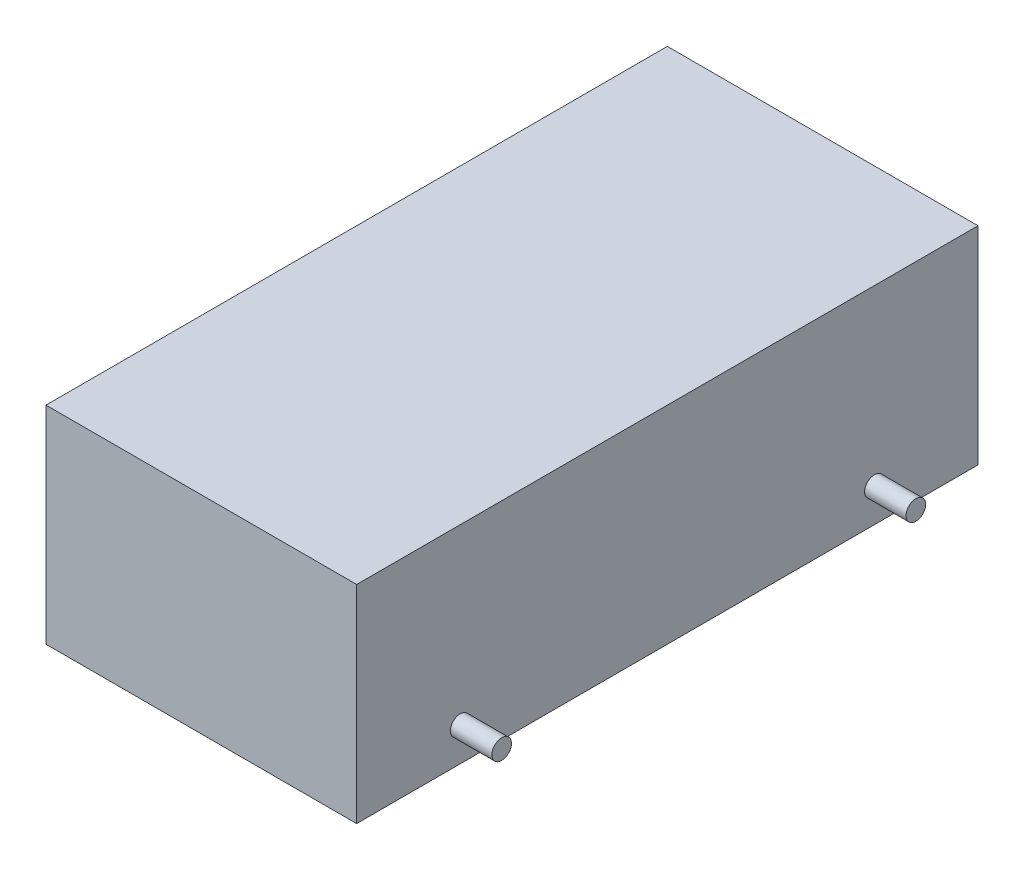
ISO-10303-21;
HEADER;
FILE_DESCRIPTION(('STEP AP214'),'2;1');
FILE_NAME('part.step','',(''),(''),'','','');
FILE_SCHEMA(('AUTOMOTIVE_DESIGN { 1 0 10303 214 1 1 1 1 }'));
ENDSEC;
DATA;
#1=APPLICATION_CONTEXT('core data for automotive mechanical design processes');
#2=APPLICATION_PROTOCOL_DEFINITION('international standard','automotive_design',2000,#1);
#3=PRODUCT_CONTEXT('',#1,'mechanical');
#4=PRODUCT('Part','Part','',(#3));
#5=PRODUCT_RELATED_PRODUCT_CATEGORY('part','',(#4));
#6=PRODUCT_DEFINITION_FORMATION('','',#4);
#7=PRODUCT_DEFINITION_CONTEXT('part definition',#1,'design');
#8=PRODUCT_DEFINITION('design','',#6,#7);
#9=PRODUCT_DEFINITION_SHAPE('','',#8);
#10=(LENGTH_UNIT() NAMED_UNIT(*) SI_UNIT(.MILLI.,.METRE.));
#11=(NAMED_UNIT(*) PLANE_ANGLE_UNIT() SI_UNIT($,.RADIAN.));
#12=(NAMED_UNIT(*) SI_UNIT($,.STERADIAN.) SOLID_ANGLE_UNIT());
#13=UNCERTAINTY_MEASURE_WITH_UNIT(LENGTH_MEASURE(1.E-05),#10,'distance_accuracy_value','');
#14=(GEOMETRIC_REPRESENTATION_CONTEXT(3) GLOBAL_UNCERTAINTY_ASSIGNED_CONTEXT((#13)) GLOBAL_UNIT_ASSIGNED_CONTEXT((#10,
#11,#12)) REPRESENTATION_CONTEXT('',''));
#15=CARTESIAN_POINT('',(0.,0.,0.));
#16=DIRECTION('',(0.,0.,1.));
#17=DIRECTION('',(1.,0.,0.));
#18=AXIS2_PLACEMENT_3D('',#15,#16,#17);
#19=CARTESIAN_POINT('',(-37.5,25.,150.));
#20=DIRECTION('',(1.,0.,0.));
#21=DIRECTION('',(0.,0.,-1.));
#22=AXIS2_PLACEMENT_3D('',#19,#20,#21);
#23=PLANE('',#22);
#24=CARTESIAN_POINT('',(-37.5,-16.9191545779192,125.));
#25=DIRECTION('',(1.,0.,0.));
#26=DIRECTION('',(0.,0.,-1.));
#27=AXIS2_PLACEMENT_3D('',#24,#25,#26);
#28=CIRCLE('',#27,2.36964720538208);
#29=CARTESIAN_POINT('',(-37.5,-16.9191545779192,122.630352794618));
#30=VERTEX_POINT('',#29);
#31=EDGE_CURVE('E11',#30,#30,#28,.F.);
#32=ORIENTED_EDGE('',*,*,#31,.F.);
#33=EDGE_LOOP('',(#32));
#34=FACE_BOUND('',#33,.T.);
#35=CARTESIAN_POINT('',(-37.5,-16.9191545779192,25.));
#36=DIRECTION('',(1.,0.,0.));
#37=DIRECTION('',(0.,0.,-1.));
#38=AXIS2_PLACEMENT_3D('',#35,#36,#37);
#39=CIRCLE('',#38,2.36964720538207);
#40=CARTESIAN_POINT('',(-37.5,-16.9191545779192,22.6303527946179));
#41=VERTEX_POINT('',#40);
#42=EDGE_CURVE('E54',#41,#41,#39,.F.);
#43=ORIENTED_EDGE('',*,*,#42,.F.);
#44=EDGE_LOOP('',(#43));
#45=FACE_BOUND('',#44,.T.);
#46=DIRECTION('',(0.,-1.,0.));
#47=VECTOR('',#46,1.);
#48=CARTESIAN_POINT('',(-37.5,25.,0.));
#49=LINE('',#48,#47);
#50=CARTESIAN_POINT('',(-37.5,25.,0.));
#51=VERTEX_POINT('',#50);
#52=CARTESIAN_POINT('',(-37.5,-25.,0.));
#53=VERTEX_POINT('',#52);
#54=EDGE_CURVE('E117',#51,#53,#49,.T.);
#55=ORIENTED_EDGE('',*,*,#54,.T.);
#56=DIRECTION('',(0.,0.,-1.));
#57=VECTOR('',#56,1.);
#58=CARTESIAN_POINT('',(-37.5,-25.,150.));
#59=LINE('',#58,#57);
#60=CARTESIAN_POINT('',(-37.5,-25.,150.));
#61=VERTEX_POINT('',#60);
#62=EDGE_CURVE('E106',#61,#53,#59,.T.);
#63=ORIENTED_EDGE('',*,*,#62,.F.);
#64=DIRECTION('',(0.,-1.,0.));
#65=VECTOR('',#64,1.);
#66=CARTESIAN_POINT('',(-37.5,25.,150.));
#67=LINE('',#66,#65);
#68=CARTESIAN_POINT('',(-37.5,25.,150.));
#69=VERTEX_POINT('',#68);
#70=EDGE_CURVE('E98',#69,#61,#67,.T.);
#71=ORIENTED_EDGE('',*,*,#70,.F.);
#72=DIRECTION('',(0.,0.,-1.));
#73=VECTOR('',#72,1.);
#74=CARTESIAN_POINT('',(-37.5,25.,150.));
#75=LINE('',#74,#73);
#76=EDGE_CURVE('E113',#69,#51,#75,.T.);
#77=ORIENTED_EDGE('',*,*,#76,.T.);
#78=EDGE_LOOP('',(#55,#63,#71,#77));
#79=FACE_BOUND('',#78,.T.);
#80=ADVANCED_FACE('F45',(#34,#45,#79),#23,.F.);
#81=CARTESIAN_POINT('',(-37.5,-25.,150.));
#82=DIRECTION('',(0.,1.,0.));
#83=DIRECTION('',(0.,0.,1.));
#84=AXIS2_PLACEMENT_3D('',#81,#82,#83);
#85=PLANE('',#84);
#86=DIRECTION('',(1.,0.,0.));
#87=VECTOR('',#86,1.);
#88=CARTESIAN_POINT('',(-37.5,-25.,0.));
#89=LINE('',#88,#87);
#90=CARTESIAN_POINT('',(37.5,-25.,0.));
#91=VERTEX_POINT('',#90);
#92=EDGE_CURVE('E104',#53,#91,#89,.T.);
#93=ORIENTED_EDGE('',*,*,#92,.T.);
#94=DIRECTION('',(0.,0.,-1.));
#95=VECTOR('',#94,1.);
#96=CARTESIAN_POINT('',(37.5,-25.,150.));
#97=LINE('',#96,#95);
#98=CARTESIAN_POINT('',(37.5,-25.,150.));
#99=VERTEX_POINT('',#98);
#100=EDGE_CURVE('E102',#99,#91,#97,.T.);
#101=ORIENTED_EDGE('',*,*,#100,.F.);
#102=DIRECTION('',(1.,0.,0.));
#103=VECTOR('',#102,1.);
#104=CARTESIAN_POINT('',(-37.5,-25.,150.));
#105=LINE('',#104,#103);
#106=EDGE_CURVE('E93',#61,#99,#105,.T.);
#107=ORIENTED_EDGE('',*,*,#106,.F.);
#108=ORIENTED_EDGE('',*,*,#62,.T.);
#109=EDGE_LOOP('',(#93,#101,#107,#108));
#110=FACE_BOUND('',#109,.T.);
#111=ADVANCED_FACE('F103',(#110),#85,.F.);
#112=CARTESIAN_POINT('',(37.5,25.,150.));
#113=DIRECTION('',(-1.,0.,0.));
#114=DIRECTION('',(0.,-1.,0.));
#115=AXIS2_PLACEMENT_3D('',#112,#113,#114);
#116=PLANE('',#115);
#117=CARTESIAN_POINT('',(37.5,-16.9191545779192,25.));
#118=DIRECTION('',(-1.,0.,0.));
#119=DIRECTION('',(0.,-1.,0.));
#120=AXIS2_PLACEMENT_3D('',#117,#118,#119);
#121=CIRCLE('',#120,2.36964720538207);
#122=CARTESIAN_POINT('',(37.5,-19.2888017833012,25.));
#123=VERTEX_POINT('',#122);
#124=EDGE_CURVE('E138',#123,#123,#121,.F.);
#125=ORIENTED_EDGE('',*,*,#124,.F.);
#126=EDGE_LOOP('',(#125));
#127=FACE_BOUND('',#126,.T.);
#128=CARTESIAN_POINT('',(37.5,-16.9191545779192,125.));
#129=DIRECTION('',(-1.,0.,0.));
#130=DIRECTION('',(0.,-1.,0.));
#131=AXIS2_PLACEMENT_3D('',#128,#129,#130);
#132=CIRCLE('',#131,2.36964720538207);
#133=CARTESIAN_POINT('',(37.5,-19.2888017833012,125.));
#134=VERTEX_POINT('',#133);
#135=EDGE_CURVE('E134',#134,#134,#132,.F.);
#136=ORIENTED_EDGE('',*,*,#135,.F.);
#137=EDGE_LOOP('',(#136));
#138=FACE_BOUND('',#137,.T.);
#139=DIRECTION('',(0.,1.,0.));
#140=VECTOR('',#139,1.);
#141=CARTESIAN_POINT('',(37.5,25.,0.));
#142=LINE('',#141,#140);
#143=CARTESIAN_POINT('',(37.5,25.,0.));
#144=VERTEX_POINT('',#143);
#145=EDGE_CURVE('E79',#91,#144,#142,.T.);
#146=ORIENTED_EDGE('',*,*,#145,.T.);
#147=DIRECTION('',(0.,0.,-1.));
#148=VECTOR('',#147,1.);
#149=CARTESIAN_POINT('',(37.5,25.,150.));
#150=LINE('',#149,#148);
#151=CARTESIAN_POINT('',(37.5,25.,150.));
#152=VERTEX_POINT('',#151);
#153=EDGE_CURVE('E107',#152,#144,#150,.T.);
#154=ORIENTED_EDGE('',*,*,#153,.F.);
#155=DIRECTION('',(0.,1.,0.));
#156=VECTOR('',#155,1.);
#157=CARTESIAN_POINT('',(37.5,25.,150.));
#158=LINE('',#157,#156);
#159=EDGE_CURVE('E96',#99,#152,#158,.T.);
#160=ORIENTED_EDGE('',*,*,#159,.F.);
#161=ORIENTED_EDGE('',*,*,#100,.T.);
#162=EDGE_LOOP('',(#146,#154,#160,#161));
#163=FACE_BOUND('',#162,.T.);
#164=ADVANCED_FACE('F109',(#127,#138,#163),#116,.F.);
#165=CARTESIAN_POINT('',(-37.5,25.,150.));
#166=DIRECTION('',(0.,-1.,0.));
#167=DIRECTION('',(0.,0.,-1.));
#168=AXIS2_PLACEMENT_3D('',#165,#166,#167);
#169=PLANE('',#168);
#170=DIRECTION('',(-1.,0.,0.));
#171=VECTOR('',#170,1.);
#172=CARTESIAN_POINT('',(-37.5,25.,0.));
#173=LINE('',#172,#171);
#174=EDGE_CURVE('E85',#144,#51,#173,.T.);
#175=ORIENTED_EDGE('',*,*,#174,.T.);
#176=ORIENTED_EDGE('',*,*,#76,.F.);
#177=DIRECTION('',(-1.,0.,0.));
#178=VECTOR('',#177,1.);
#179=CARTESIAN_POINT('',(-37.5,25.,150.));
#180=LINE('',#179,#178);
#181=EDGE_CURVE('E62',#152,#69,#180,.T.);
#182=ORIENTED_EDGE('',*,*,#181,.F.);
#183=ORIENTED_EDGE('',*,*,#153,.T.);
#184=EDGE_LOOP('',(#175,#176,#182,#183));
#185=FACE_BOUND('',#184,.T.);
#186=ADVANCED_FACE('F164',(#185),#169,.F.);
#187=CARTESIAN_POINT('',(0.,0.,150.));
#188=DIRECTION('',(0.,0.,1.));
#189=DIRECTION('',(1.,0.,0.));
#190=AXIS2_PLACEMENT_3D('',#187,#188,#189);
#191=PLANE('',#190);
#192=ORIENTED_EDGE('',*,*,#70,.T.);
#193=ORIENTED_EDGE('',*,*,#106,.T.);
#194=ORIENTED_EDGE('',*,*,#159,.T.);
#195=ORIENTED_EDGE('',*,*,#181,.T.);
#196=EDGE_LOOP('',(#192,#193,#194,#195));
#197=FACE_BOUND('',#196,.T.);
#198=ADVANCED_FACE('F94',(#197),#191,.T.);
#199=CARTESIAN_POINT('',(0.,0.,0.));
#200=DIRECTION('',(0.,0.,1.));
#201=DIRECTION('',(1.,0.,0.));
#202=AXIS2_PLACEMENT_3D('',#199,#200,#201);
#203=PLANE('',#202);
#204=ORIENTED_EDGE('',*,*,#54,.F.);
#205=ORIENTED_EDGE('',*,*,#174,.F.);
#206=ORIENTED_EDGE('',*,*,#145,.F.);
#207=ORIENTED_EDGE('',*,*,#92,.F.);
#208=EDGE_LOOP('',(#204,#205,#206,#207));
#209=FACE_BOUND('',#208,.T.);
#210=ADVANCED_FACE('F152',(#209),#203,.F.);
#211=CARTESIAN_POINT('',(47.5,-16.9191545779192,125.));
#212=DIRECTION('',(-1.,0.,0.));
#213=DIRECTION('',(0.,-1.,0.));
#214=AXIS2_PLACEMENT_3D('',#211,#212,#213);
#215=CYLINDRICAL_SURFACE('',#214,2.36964720538207);
#216=CARTESIAN_POINT('',(47.5,-16.9191545779192,125.));
#217=DIRECTION('',(1.,0.,0.));
#218=DIRECTION('',(0.,1.,0.));
#219=AXIS2_PLACEMENT_3D('',#216,#217,#218);
#220=CIRCLE('',#219,2.36964720538207);
#221=CARTESIAN_POINT('',(47.5,-14.5495073725371,125.));
#222=VERTEX_POINT('',#221);
#223=EDGE_CURVE('E121',#222,#222,#220,.T.);
#224=ORIENTED_EDGE('',*,*,#223,.F.);
#225=EDGE_LOOP('',(#224));
#226=FACE_BOUND('',#225,.T.);
#227=ORIENTED_EDGE('',*,*,#135,.T.);
#228=EDGE_LOOP('',(#227));
#229=FACE_BOUND('',#228,.T.);
#230=ADVANCED_FACE('F154',(#226,#229),#215,.T.);
#231=CARTESIAN_POINT('',(47.5,-16.9191545779192,125.));
#232=DIRECTION('',(1.,0.,0.));
#233=DIRECTION('',(0.,1.,0.));
#234=AXIS2_PLACEMENT_3D('',#231,#232,#233);
#235=PLANE('',#234);
#236=ORIENTED_EDGE('',*,*,#223,.T.);
#237=EDGE_LOOP('',(#236));
#238=FACE_BOUND('',#237,.T.);
#239=ADVANCED_FACE('F161',(#238),#235,.T.);
#240=CARTESIAN_POINT('',(47.5,-16.9191545779192,25.));
#241=DIRECTION('',(-1.,0.,0.));
#242=DIRECTION('',(0.,-1.,0.));
#243=AXIS2_PLACEMENT_3D('',#240,#241,#242);
#244=CYLINDRICAL_SURFACE('',#243,2.36964720538207);
#245=CARTESIAN_POINT('',(47.5,-16.9191545779192,25.));
#246=DIRECTION('',(1.,0.,0.));
#247=DIRECTION('',(0.,1.,0.));
#248=AXIS2_PLACEMENT_3D('',#245,#246,#247);
#249=CIRCLE('',#248,2.36964720538207);
#250=CARTESIAN_POINT('',(47.5,-14.5495073725371,25.));
#251=VERTEX_POINT('',#250);
#252=EDGE_CURVE('E253',#251,#251,#249,.T.);
#253=ORIENTED_EDGE('',*,*,#252,.F.);
#254=EDGE_LOOP('',(#253));
#255=FACE_BOUND('',#254,.T.);
#256=ORIENTED_EDGE('',*,*,#124,.T.);
#257=EDGE_LOOP('',(#256));
#258=FACE_BOUND('',#257,.T.);
#259=ADVANCED_FACE('F196',(#255,#258),#244,.T.);
#260=CARTESIAN_POINT('',(47.5,-16.9191545779192,25.));
#261=DIRECTION('',(1.,0.,0.));
#262=DIRECTION('',(0.,1.,0.));
#263=AXIS2_PLACEMENT_3D('',#260,#261,#262);
#264=PLANE('',#263);
#265=ORIENTED_EDGE('',*,*,#252,.T.);
#266=EDGE_LOOP('',(#265));
#267=FACE_BOUND('',#266,.T.);
#268=ADVANCED_FACE('F204',(#267),#264,.T.);
#269=CARTESIAN_POINT('',(-47.5,-16.9191545779192,25.));
#270=DIRECTION('',(1.,0.,0.));
#271=DIRECTION('',(0.,0.,-1.));
#272=AXIS2_PLACEMENT_3D('',#269,#270,#271);
#273=CYLINDRICAL_SURFACE('',#272,2.36964720538207);
#274=CARTESIAN_POINT('',(-47.5,-16.9191545779192,25.));
#275=DIRECTION('',(-1.,0.,0.));
#276=DIRECTION('',(0.,0.,1.));
#277=AXIS2_PLACEMENT_3D('',#274,#275,#276);
#278=CIRCLE('',#277,2.36964720538207);
#279=CARTESIAN_POINT('',(-47.5,-16.9191545779192,27.3696472053821));
#280=VERTEX_POINT('',#279);
#281=EDGE_CURVE('E249',#280,#280,#278,.T.);
#282=ORIENTED_EDGE('',*,*,#281,.F.);
#283=EDGE_LOOP('',(#282));
#284=FACE_BOUND('',#283,.T.);
#285=ORIENTED_EDGE('',*,*,#42,.T.);
#286=EDGE_LOOP('',(#285));
#287=FACE_BOUND('',#286,.T.);
#288=ADVANCED_FACE('F145',(#284,#287),#273,.T.);
#289=CARTESIAN_POINT('',(-47.5,-16.9191545779192,25.));
#290=DIRECTION('',(-1.,0.,0.));
#291=DIRECTION('',(0.,0.,1.));
#292=AXIS2_PLACEMENT_3D('',#289,#290,#291);
#293=PLANE('',#292);
#294=ORIENTED_EDGE('',*,*,#281,.T.);
#295=EDGE_LOOP('',(#294));
#296=FACE_BOUND('',#295,.T.);
#297=ADVANCED_FACE('F219',(#296),#293,.T.);
#298=CARTESIAN_POINT('',(-47.5,-16.9191545779192,125.));
#299=DIRECTION('',(1.,0.,0.));
#300=DIRECTION('',(0.,0.,-1.));
#301=AXIS2_PLACEMENT_3D('',#298,#299,#300);
#302=CYLINDRICAL_SURFACE('',#301,2.36964720538208);
#303=CARTESIAN_POINT('',(-47.5,-16.9191545779192,125.));
#304=DIRECTION('',(-1.,0.,0.));
#305=DIRECTION('',(0.,0.,1.));
#306=AXIS2_PLACEMENT_3D('',#303,#304,#305);
#307=CIRCLE('',#306,2.36964720538208);
#308=CARTESIAN_POINT('',(-47.5,-16.9191545779192,127.369647205382));
#309=VERTEX_POINT('',#308);
#310=EDGE_CURVE('E247',#309,#309,#307,.T.);
#311=ORIENTED_EDGE('',*,*,#310,.F.);
#312=EDGE_LOOP('',(#311));
#313=FACE_BOUND('',#312,.T.);
#314=ORIENTED_EDGE('',*,*,#31,.T.);
#315=EDGE_LOOP('',(#314));
#316=FACE_BOUND('',#315,.T.);
#317=ADVANCED_FACE('F227',(#313,#316),#302,.T.);
#318=CARTESIAN_POINT('',(-47.5,-16.9191545779192,125.));
#319=DIRECTION('',(-1.,0.,0.));
#320=DIRECTION('',(0.,0.,1.));
#321=AXIS2_PLACEMENT_3D('',#318,#319,#320);
#322=PLANE('',#321);
#323=ORIENTED_EDGE('',*,*,#310,.T.);
#324=EDGE_LOOP('',(#323));
#325=FACE_BOUND('',#324,.T.);
#326=ADVANCED_FACE('F235',(#325),#322,.T.);
#327=CLOSED_SHELL('',(#80,#111,#164,#186,#198,#210,#230,#239,#259,#268,#288,#297,#317,#326));
#328=MANIFOLD_SOLID_BREP('B2',#327);
#329=ADVANCED_BREP_SHAPE_REPRESENTATION('',(#18,#328),#14);
#330=SHAPE_DEFINITION_REPRESENTATION(#9,#329);
ENDSEC;
END-ISO-10303-21;
